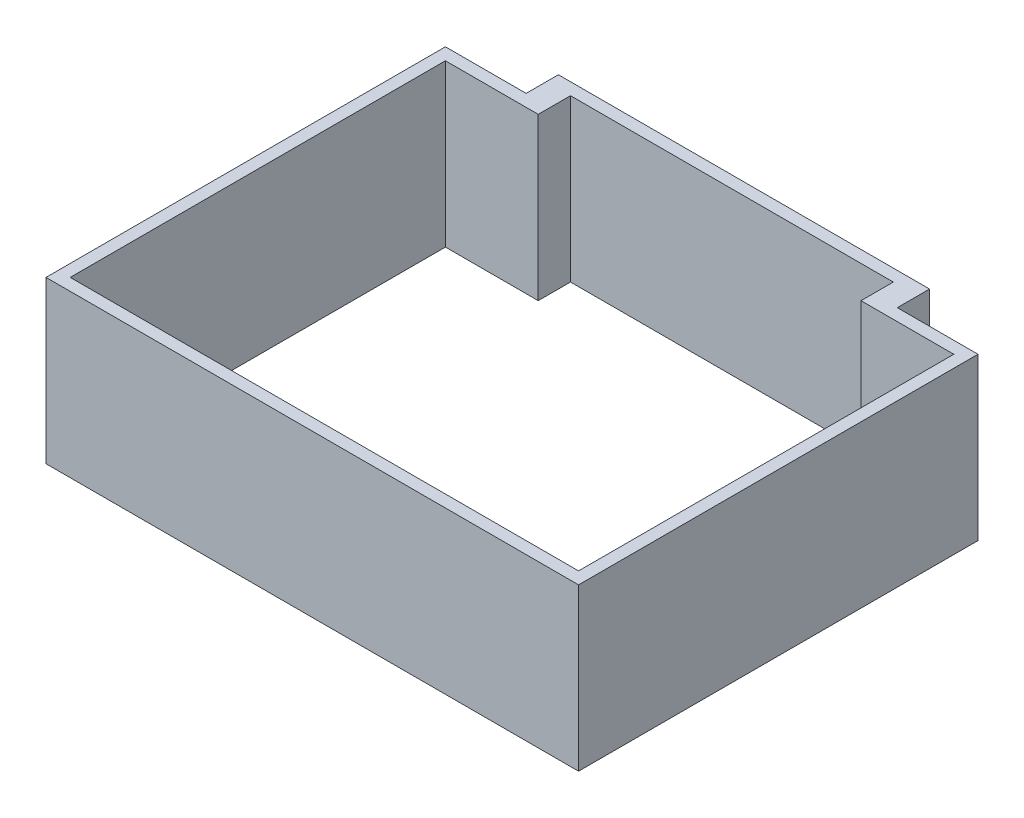
ISO-10303-21;
HEADER;
FILE_DESCRIPTION(('STEP AP214'),'2;1');
FILE_NAME('part.step','',(''),(''),'','','');
FILE_SCHEMA(('AUTOMOTIVE_DESIGN { 1 0 10303 214 1 1 1 1 }'));
ENDSEC;
DATA;
#1=APPLICATION_CONTEXT('core data for automotive mechanical design processes');
#2=APPLICATION_PROTOCOL_DEFINITION('international standard','automotive_design',2000,#1);
#3=PRODUCT_CONTEXT('',#1,'mechanical');
#4=PRODUCT('Part','Part','',(#3));
#5=PRODUCT_RELATED_PRODUCT_CATEGORY('part','',(#4));
#6=PRODUCT_DEFINITION_FORMATION('','',#4);
#7=PRODUCT_DEFINITION_CONTEXT('part definition',#1,'design');
#8=PRODUCT_DEFINITION('design','',#6,#7);
#9=PRODUCT_DEFINITION_SHAPE('','',#8);
#10=(LENGTH_UNIT() NAMED_UNIT(*) SI_UNIT(.MILLI.,.METRE.));
#11=(NAMED_UNIT(*) PLANE_ANGLE_UNIT() SI_UNIT($,.RADIAN.));
#12=(NAMED_UNIT(*) SI_UNIT($,.STERADIAN.) SOLID_ANGLE_UNIT());
#13=UNCERTAINTY_MEASURE_WITH_UNIT(LENGTH_MEASURE(1.E-05),#10,'distance_accuracy_value','');
#14=(GEOMETRIC_REPRESENTATION_CONTEXT(3) GLOBAL_UNCERTAINTY_ASSIGNED_CONTEXT((#13)) GLOBAL_UNIT_ASSIGNED_CONTEXT((#10,
#11,#12)) REPRESENTATION_CONTEXT('',''));
#15=CARTESIAN_POINT('',(0.,0.,0.));
#16=DIRECTION('',(0.,0.,1.));
#17=DIRECTION('',(1.,0.,0.));
#18=AXIS2_PLACEMENT_3D('',#15,#16,#17);
#19=CARTESIAN_POINT('',(0.,0.,5.5));
#20=DIRECTION('',(0.,0.,1.));
#21=DIRECTION('',(1.,0.,0.));
#22=AXIS2_PLACEMENT_3D('',#19,#20,#21);
#23=PLANE('',#22);
#24=DIRECTION('',(1.,0.,0.));
#25=VECTOR('',#24,1.);
#26=CARTESIAN_POINT('',(20.,-10.,5.5));
#27=LINE('',#26,#25);
#28=CARTESIAN_POINT('',(20.,-10.,5.5));
#29=VERTEX_POINT('',#28);
#30=CARTESIAN_POINT('',(31.5,-10.,5.5));
#31=VERTEX_POINT('',#30);
#32=EDGE_CURVE('E56',#29,#31,#27,.T.);
#33=ORIENTED_EDGE('',*,*,#32,.T.);
#34=DIRECTION('',(0.,1.,0.));
#35=VECTOR('',#34,1.);
#36=CARTESIAN_POINT('',(31.5,0.,5.5));
#37=LINE('',#36,#35);
#38=CARTESIAN_POINT('',(31.5,10.,5.5));
#39=VERTEX_POINT('',#38);
#40=EDGE_CURVE('E199',#31,#39,#37,.T.);
#41=ORIENTED_EDGE('',*,*,#40,.T.);
#42=DIRECTION('',(-1.,0.,0.));
#43=VECTOR('',#42,1.);
#44=CARTESIAN_POINT('',(23.,10.,5.5));
#45=LINE('',#44,#43);
#46=CARTESIAN_POINT('',(20.,10.,5.5));
#47=VERTEX_POINT('',#46);
#48=EDGE_CURVE('E215',#39,#47,#45,.T.);
#49=ORIENTED_EDGE('',*,*,#48,.T.);
#50=DIRECTION('',(0.,-1.,0.));
#51=VECTOR('',#50,1.);
#52=CARTESIAN_POINT('',(20.,10.,5.5));
#53=LINE('',#52,#51);
#54=EDGE_CURVE('E212',#47,#29,#53,.T.);
#55=ORIENTED_EDGE('',*,*,#54,.T.);
#56=EDGE_LOOP('',(#33,#41,#49,#55));
#57=FACE_BOUND('',#56,.T.);
#58=ADVANCED_FACE('F41',(#57),#23,.T.);
#59=CARTESIAN_POINT('',(23.,-10.,5.5));
#60=DIRECTION('',(-1.,0.,0.));
#61=DIRECTION('',(0.,0.,1.));
#62=AXIS2_PLACEMENT_3D('',#59,#60,#61);
#63=PLANE('',#62);
#64=DIRECTION('',(0.,1.,0.));
#65=VECTOR('',#64,1.);
#66=CARTESIAN_POINT('',(23.,-10.,4.));
#67=LINE('',#66,#65);
#68=CARTESIAN_POINT('',(23.,-10.,4.));
#69=VERTEX_POINT('',#68);
#70=CARTESIAN_POINT('',(23.,10.,4.));
#71=VERTEX_POINT('',#70);
#72=EDGE_CURVE('E11',#69,#71,#67,.T.);
#73=ORIENTED_EDGE('',*,*,#72,.F.);
#74=DIRECTION('',(0.,0.,-1.));
#75=VECTOR('',#74,1.);
#76=CARTESIAN_POINT('',(23.,-10.,5.5));
#77=LINE('',#76,#75);
#78=CARTESIAN_POINT('',(23.,-10.,0.));
#79=VERTEX_POINT('',#78);
#80=EDGE_CURVE('E224',#69,#79,#77,.T.);
#81=ORIENTED_EDGE('',*,*,#80,.T.);
#82=DIRECTION('',(0.,1.,0.));
#83=VECTOR('',#82,1.);
#84=CARTESIAN_POINT('',(23.,-10.,0.));
#85=LINE('',#84,#83);
#86=CARTESIAN_POINT('',(23.,10.,0.));
#87=VERTEX_POINT('',#86);
#88=EDGE_CURVE('E211',#79,#87,#85,.T.);
#89=ORIENTED_EDGE('',*,*,#88,.T.);
#90=DIRECTION('',(0.,0.,-1.));
#91=VECTOR('',#90,1.);
#92=CARTESIAN_POINT('',(23.,10.,5.5));
#93=LINE('',#92,#91);
#94=EDGE_CURVE('E222',#71,#87,#93,.T.);
#95=ORIENTED_EDGE('',*,*,#94,.F.);
#96=EDGE_LOOP('',(#73,#81,#89,#95));
#97=FACE_BOUND('',#96,.T.);
#98=ADVANCED_FACE('F294',(#97),#63,.F.);
#99=CARTESIAN_POINT('',(0.,0.,1.5));
#100=DIRECTION('',(0.,0.,1.));
#101=DIRECTION('',(1.,0.,0.));
#102=AXIS2_PLACEMENT_3D('',#99,#100,#101);
#103=PLANE('',#102);
#104=DIRECTION('',(1.,0.,0.));
#105=VECTOR('',#104,1.);
#106=CARTESIAN_POINT('',(-22.,-10.,1.5));
#107=LINE('',#106,#105);
#108=CARTESIAN_POINT('',(-20.,-10.,1.5));
#109=VERTEX_POINT('',#108);
#110=CARTESIAN_POINT('',(20.,-10.,1.5));
#111=VERTEX_POINT('',#110);
#112=EDGE_CURVE('E270',#109,#111,#107,.T.);
#113=ORIENTED_EDGE('',*,*,#112,.T.);
#114=DIRECTION('',(0.,1.,0.));
#115=VECTOR('',#114,1.);
#116=CARTESIAN_POINT('',(20.,0.,1.5));
#117=LINE('',#116,#115);
#118=CARTESIAN_POINT('',(20.,10.,1.5));
#119=VERTEX_POINT('',#118);
#120=EDGE_CURVE('E229',#111,#119,#117,.T.);
#121=ORIENTED_EDGE('',*,*,#120,.T.);
#122=DIRECTION('',(-1.,0.,0.));
#123=VECTOR('',#122,1.);
#124=CARTESIAN_POINT('',(22.,10.,1.5));
#125=LINE('',#124,#123);
#126=CARTESIAN_POINT('',(-20.,10.,1.5));
#127=VERTEX_POINT('',#126);
#128=EDGE_CURVE('E272',#119,#127,#125,.T.);
#129=ORIENTED_EDGE('',*,*,#128,.T.);
#130=DIRECTION('',(0.,-1.,0.));
#131=VECTOR('',#130,1.);
#132=CARTESIAN_POINT('',(-20.,0.,1.5));
#133=LINE('',#132,#131);
#134=EDGE_CURVE('E267',#127,#109,#133,.T.);
#135=ORIENTED_EDGE('',*,*,#134,.T.);
#136=EDGE_LOOP('',(#113,#121,#129,#135));
#137=FACE_BOUND('',#136,.T.);
#138=ADVANCED_FACE('F319',(#137),#103,.T.);
#139=CARTESIAN_POINT('',(0.,0.,5.5));
#140=DIRECTION('',(0.,0.,1.));
#141=DIRECTION('',(1.,0.,0.));
#142=AXIS2_PLACEMENT_3D('',#139,#140,#141);
#143=PLANE('',#142);
#144=DIRECTION('',(-1.,0.,0.));
#145=VECTOR('',#144,1.);
#146=CARTESIAN_POINT('',(-20.,10.,5.5));
#147=LINE('',#146,#145);
#148=CARTESIAN_POINT('',(-20.,10.,5.5));
#149=VERTEX_POINT('',#148);
#150=CARTESIAN_POINT('',(-31.5,10.,5.5));
#151=VERTEX_POINT('',#150);
#152=EDGE_CURVE('E252',#149,#151,#147,.T.);
#153=ORIENTED_EDGE('',*,*,#152,.T.);
#154=DIRECTION('',(0.,-1.,0.));
#155=VECTOR('',#154,1.);
#156=CARTESIAN_POINT('',(-31.5,0.,5.5));
#157=LINE('',#156,#155);
#158=CARTESIAN_POINT('',(-31.5,-10.,5.5));
#159=VERTEX_POINT('',#158);
#160=EDGE_CURVE('E240',#151,#159,#157,.T.);
#161=ORIENTED_EDGE('',*,*,#160,.T.);
#162=DIRECTION('',(1.,0.,0.));
#163=VECTOR('',#162,1.);
#164=CARTESIAN_POINT('',(-23.,-10.,5.5));
#165=LINE('',#164,#163);
#166=CARTESIAN_POINT('',(-20.,-10.,5.5));
#167=VERTEX_POINT('',#166);
#168=EDGE_CURVE('E248',#159,#167,#165,.T.);
#169=ORIENTED_EDGE('',*,*,#168,.T.);
#170=DIRECTION('',(0.,1.,0.));
#171=VECTOR('',#170,1.);
#172=CARTESIAN_POINT('',(-20.,-10.,5.5));
#173=LINE('',#172,#171);
#174=EDGE_CURVE('E250',#167,#149,#173,.T.);
#175=ORIENTED_EDGE('',*,*,#174,.T.);
#176=EDGE_LOOP('',(#153,#161,#169,#175));
#177=FACE_BOUND('',#176,.T.);
#178=ADVANCED_FACE('F334',(#177),#143,.T.);
#179=CARTESIAN_POINT('',(-23.,10.,5.5));
#180=DIRECTION('',(1.,0.,0.));
#181=DIRECTION('',(0.,0.,-1.));
#182=AXIS2_PLACEMENT_3D('',#179,#180,#181);
#183=PLANE('',#182);
#184=DIRECTION('',(0.,-1.,0.));
#185=VECTOR('',#184,1.);
#186=CARTESIAN_POINT('',(-23.,10.,4.));
#187=LINE('',#186,#185);
#188=CARTESIAN_POINT('',(-23.,10.,4.));
#189=VERTEX_POINT('',#188);
#190=CARTESIAN_POINT('',(-23.,-10.,4.));
#191=VERTEX_POINT('',#190);
#192=EDGE_CURVE('E49',#189,#191,#187,.T.);
#193=ORIENTED_EDGE('',*,*,#192,.F.);
#194=DIRECTION('',(0.,0.,-1.));
#195=VECTOR('',#194,1.);
#196=CARTESIAN_POINT('',(-23.,10.,5.5));
#197=LINE('',#196,#195);
#198=CARTESIAN_POINT('',(-23.,10.,0.));
#199=VERTEX_POINT('',#198);
#200=EDGE_CURVE('E254',#189,#199,#197,.T.);
#201=ORIENTED_EDGE('',*,*,#200,.T.);
#202=DIRECTION('',(0.,-1.,0.));
#203=VECTOR('',#202,1.);
#204=CARTESIAN_POINT('',(-23.,10.,0.));
#205=LINE('',#204,#203);
#206=CARTESIAN_POINT('',(-23.,-10.,0.));
#207=VERTEX_POINT('',#206);
#208=EDGE_CURVE('E164',#199,#207,#205,.T.);
#209=ORIENTED_EDGE('',*,*,#208,.T.);
#210=DIRECTION('',(0.,0.,-1.));
#211=VECTOR('',#210,1.);
#212=CARTESIAN_POINT('',(-23.,-10.,5.5));
#213=LINE('',#212,#211);
#214=EDGE_CURVE('E265',#191,#207,#213,.T.);
#215=ORIENTED_EDGE('',*,*,#214,.F.);
#216=EDGE_LOOP('',(#193,#201,#209,#215));
#217=FACE_BOUND('',#216,.T.);
#218=ADVANCED_FACE('F284',(#217),#183,.F.);
#219=CARTESIAN_POINT('',(-22.,-10.,1.5));
#220=DIRECTION('',(0.,1.,0.));
#221=DIRECTION('',(0.,0.,1.));
#222=AXIS2_PLACEMENT_3D('',#219,#220,#221);
#223=PLANE('',#222);
#224=DIRECTION('',(0.,0.,-1.));
#225=VECTOR('',#224,1.);
#226=CARTESIAN_POINT('',(-31.5,-10.,52.));
#227=LINE('',#226,#225);
#228=CARTESIAN_POINT('',(-31.5,-10.,52.));
#229=VERTEX_POINT('',#228);
#230=EDGE_CURVE('E237',#229,#159,#227,.T.);
#231=ORIENTED_EDGE('',*,*,#230,.F.);
#232=DIRECTION('',(1.,0.,0.));
#233=VECTOR('',#232,1.);
#234=CARTESIAN_POINT('',(-33.,-10.,52.));
#235=LINE('',#234,#233);
#236=CARTESIAN_POINT('',(31.5,-10.,52.));
#237=VERTEX_POINT('',#236);
#238=EDGE_CURVE('E183',#229,#237,#235,.T.);
#239=ORIENTED_EDGE('',*,*,#238,.T.);
#240=DIRECTION('',(0.,0.,-1.));
#241=VECTOR('',#240,1.);
#242=CARTESIAN_POINT('',(31.5,-10.,52.));
#243=LINE('',#242,#241);
#244=EDGE_CURVE('E196',#237,#31,#243,.T.);
#245=ORIENTED_EDGE('',*,*,#244,.T.);
#246=ORIENTED_EDGE('',*,*,#32,.F.);
#247=DIRECTION('',(0.,0.,-1.));
#248=VECTOR('',#247,1.);
#249=CARTESIAN_POINT('',(20.,-10.,5.5));
#250=LINE('',#249,#248);
#251=EDGE_CURVE('E226',#29,#111,#250,.T.);
#252=ORIENTED_EDGE('',*,*,#251,.T.);
#253=ORIENTED_EDGE('',*,*,#112,.F.);
#254=DIRECTION('',(0.,0.,-1.));
#255=VECTOR('',#254,1.);
#256=CARTESIAN_POINT('',(-20.,-10.,5.5));
#257=LINE('',#256,#255);
#258=EDGE_CURVE('E262',#167,#109,#257,.T.);
#259=ORIENTED_EDGE('',*,*,#258,.F.);
#260=ORIENTED_EDGE('',*,*,#168,.F.);
#261=EDGE_LOOP('',(#231,#239,#245,#246,#252,#253,#259,#260));
#262=FACE_BOUND('',#261,.T.);
#263=DIRECTION('',(0.,0.,-1.));
#264=VECTOR('',#263,1.);
#265=CARTESIAN_POINT('',(33.,-10.,5.5));
#266=LINE('',#265,#264);
#267=CARTESIAN_POINT('',(33.,-10.,53.5));
#268=VERTEX_POINT('',#267);
#269=CARTESIAN_POINT('',(33.,-10.,4.));
#270=VERTEX_POINT('',#269);
#271=EDGE_CURVE('E170',#268,#270,#266,.T.);
#272=ORIENTED_EDGE('',*,*,#271,.F.);
#273=DIRECTION('',(1.,0.,0.));
#274=VECTOR('',#273,1.);
#275=CARTESIAN_POINT('',(-33.,-10.,53.5));
#276=LINE('',#275,#274);
#277=CARTESIAN_POINT('',(-33.,-10.,53.5));
#278=VERTEX_POINT('',#277);
#279=EDGE_CURVE('E168',#278,#268,#276,.T.);
#280=ORIENTED_EDGE('',*,*,#279,.F.);
#281=DIRECTION('',(0.,0.,-1.));
#282=VECTOR('',#281,1.);
#283=CARTESIAN_POINT('',(-33.,-10.,5.5));
#284=LINE('',#283,#282);
#285=CARTESIAN_POINT('',(-33.,-10.,4.));
#286=VERTEX_POINT('',#285);
#287=EDGE_CURVE('E155',#278,#286,#284,.T.);
#288=ORIENTED_EDGE('',*,*,#287,.T.);
#289=DIRECTION('',(1.,0.,0.));
#290=VECTOR('',#289,1.);
#291=CARTESIAN_POINT('',(-33.,-10.,4.));
#292=LINE('',#291,#290);
#293=EDGE_CURVE('E243',#286,#191,#292,.T.);
#294=ORIENTED_EDGE('',*,*,#293,.T.);
#295=ORIENTED_EDGE('',*,*,#214,.T.);
#296=DIRECTION('',(1.,0.,0.));
#297=VECTOR('',#296,1.);
#298=CARTESIAN_POINT('',(-22.,-10.,0.));
#299=LINE('',#298,#297);
#300=EDGE_CURVE('E269',#207,#79,#299,.T.);
#301=ORIENTED_EDGE('',*,*,#300,.T.);
#302=ORIENTED_EDGE('',*,*,#80,.F.);
#303=DIRECTION('',(1.,0.,0.));
#304=VECTOR('',#303,1.);
#305=CARTESIAN_POINT('',(21.,-10.,4.));
#306=LINE('',#305,#304);
#307=EDGE_CURVE('E201',#69,#270,#306,.T.);
#308=ORIENTED_EDGE('',*,*,#307,.T.);
#309=EDGE_LOOP('',(#272,#280,#288,#294,#295,#301,#302,#308));
#310=FACE_BOUND('',#309,.T.);
#311=ADVANCED_FACE('F43',(#262,#310),#223,.F.);
#312=CARTESIAN_POINT('',(22.,10.,1.5));
#313=DIRECTION('',(0.,-1.,0.));
#314=DIRECTION('',(0.,0.,-1.));
#315=AXIS2_PLACEMENT_3D('',#312,#313,#314);
#316=PLANE('',#315);
#317=DIRECTION('',(0.,0.,-1.));
#318=VECTOR('',#317,1.);
#319=CARTESIAN_POINT('',(-33.,10.,5.5));
#320=LINE('',#319,#318);
#321=CARTESIAN_POINT('',(-33.,10.,53.5));
#322=VERTEX_POINT('',#321);
#323=CARTESIAN_POINT('',(-33.,10.,4.));
#324=VERTEX_POINT('',#323);
#325=EDGE_CURVE('E165',#322,#324,#320,.T.);
#326=ORIENTED_EDGE('',*,*,#325,.F.);
#327=DIRECTION('',(-1.,0.,0.));
#328=VECTOR('',#327,1.);
#329=CARTESIAN_POINT('',(33.,10.,53.5));
#330=LINE('',#329,#328);
#331=CARTESIAN_POINT('',(33.,10.,53.5));
#332=VERTEX_POINT('',#331);
#333=EDGE_CURVE('E179',#332,#322,#330,.T.);
#334=ORIENTED_EDGE('',*,*,#333,.F.);
#335=DIRECTION('',(0.,0.,-1.));
#336=VECTOR('',#335,1.);
#337=CARTESIAN_POINT('',(33.,10.,5.5));
#338=LINE('',#337,#336);
#339=CARTESIAN_POINT('',(33.,10.,4.));
#340=VERTEX_POINT('',#339);
#341=EDGE_CURVE('E207',#332,#340,#338,.T.);
#342=ORIENTED_EDGE('',*,*,#341,.T.);
#343=DIRECTION('',(-1.,0.,0.));
#344=VECTOR('',#343,1.);
#345=CARTESIAN_POINT('',(33.,10.,4.));
#346=LINE('',#345,#344);
#347=EDGE_CURVE('E205',#340,#71,#346,.T.);
#348=ORIENTED_EDGE('',*,*,#347,.T.);
#349=ORIENTED_EDGE('',*,*,#94,.T.);
#350=DIRECTION('',(-1.,0.,0.));
#351=VECTOR('',#350,1.);
#352=CARTESIAN_POINT('',(22.,10.,0.));
#353=LINE('',#352,#351);
#354=EDGE_CURVE('E273',#87,#199,#353,.T.);
#355=ORIENTED_EDGE('',*,*,#354,.T.);
#356=ORIENTED_EDGE('',*,*,#200,.F.);
#357=DIRECTION('',(-1.,0.,0.));
#358=VECTOR('',#357,1.);
#359=CARTESIAN_POINT('',(-21.,10.,4.));
#360=LINE('',#359,#358);
#361=EDGE_CURVE('E245',#189,#324,#360,.T.);
#362=ORIENTED_EDGE('',*,*,#361,.T.);
#363=EDGE_LOOP('',(#326,#334,#342,#348,#349,#355,#356,#362));
#364=FACE_BOUND('',#363,.T.);
#365=DIRECTION('',(-1.,0.,0.));
#366=VECTOR('',#365,1.);
#367=CARTESIAN_POINT('',(33.,10.,52.));
#368=LINE('',#367,#366);
#369=CARTESIAN_POINT('',(31.5,10.,52.));
#370=VERTEX_POINT('',#369);
#371=CARTESIAN_POINT('',(-31.5,10.,52.));
#372=VERTEX_POINT('',#371);
#373=EDGE_CURVE('E180',#370,#372,#368,.T.);
#374=ORIENTED_EDGE('',*,*,#373,.T.);
#375=DIRECTION('',(0.,0.,-1.));
#376=VECTOR('',#375,1.);
#377=CARTESIAN_POINT('',(-31.5,10.,52.));
#378=LINE('',#377,#376);
#379=EDGE_CURVE('E234',#372,#151,#378,.T.);
#380=ORIENTED_EDGE('',*,*,#379,.T.);
#381=ORIENTED_EDGE('',*,*,#152,.F.);
#382=DIRECTION('',(0.,0.,-1.));
#383=VECTOR('',#382,1.);
#384=CARTESIAN_POINT('',(-20.,10.,5.5));
#385=LINE('',#384,#383);
#386=EDGE_CURVE('E259',#149,#127,#385,.T.);
#387=ORIENTED_EDGE('',*,*,#386,.T.);
#388=ORIENTED_EDGE('',*,*,#128,.F.);
#389=DIRECTION('',(0.,0.,-1.));
#390=VECTOR('',#389,1.);
#391=CARTESIAN_POINT('',(20.,10.,5.5));
#392=LINE('',#391,#390);
#393=EDGE_CURVE('E217',#47,#119,#392,.T.);
#394=ORIENTED_EDGE('',*,*,#393,.F.);
#395=ORIENTED_EDGE('',*,*,#48,.F.);
#396=DIRECTION('',(0.,0.,-1.));
#397=VECTOR('',#396,1.);
#398=CARTESIAN_POINT('',(31.5,10.,52.));
#399=LINE('',#398,#397);
#400=EDGE_CURVE('E193',#370,#39,#399,.T.);
#401=ORIENTED_EDGE('',*,*,#400,.F.);
#402=EDGE_LOOP('',(#374,#380,#381,#387,#388,#394,#395,#401));
#403=FACE_BOUND('',#402,.T.);
#404=ADVANCED_FACE('F287',(#364,#403),#316,.F.);
#405=CARTESIAN_POINT('',(0.,0.,0.));
#406=DIRECTION('',(0.,0.,1.));
#407=DIRECTION('',(1.,0.,0.));
#408=AXIS2_PLACEMENT_3D('',#405,#406,#407);
#409=PLANE('',#408);
#410=ORIENTED_EDGE('',*,*,#88,.F.);
#411=ORIENTED_EDGE('',*,*,#300,.F.);
#412=ORIENTED_EDGE('',*,*,#208,.F.);
#413=ORIENTED_EDGE('',*,*,#354,.F.);
#414=EDGE_LOOP('',(#410,#411,#412,#413));
#415=FACE_BOUND('',#414,.T.);
#416=ADVANCED_FACE('F292',(#415),#409,.F.);
#417=CARTESIAN_POINT('',(-20.,-10.,5.5));
#418=DIRECTION('',(-1.,0.,0.));
#419=DIRECTION('',(0.,0.,1.));
#420=AXIS2_PLACEMENT_3D('',#417,#418,#419);
#421=PLANE('',#420);
#422=ORIENTED_EDGE('',*,*,#134,.F.);
#423=ORIENTED_EDGE('',*,*,#386,.F.);
#424=ORIENTED_EDGE('',*,*,#174,.F.);
#425=ORIENTED_EDGE('',*,*,#258,.T.);
#426=EDGE_LOOP('',(#422,#423,#424,#425));
#427=FACE_BOUND('',#426,.T.);
#428=ADVANCED_FACE('F331',(#427),#421,.F.);
#429=CARTESIAN_POINT('',(0.,0.,4.));
#430=DIRECTION('',(0.,0.,1.));
#431=DIRECTION('',(1.,0.,0.));
#432=AXIS2_PLACEMENT_3D('',#429,#430,#431);
#433=PLANE('',#432);
#434=DIRECTION('',(0.,-1.,0.));
#435=VECTOR('',#434,1.);
#436=CARTESIAN_POINT('',(-33.,10.,4.));
#437=LINE('',#436,#435);
#438=EDGE_CURVE('E162',#324,#286,#437,.T.);
#439=ORIENTED_EDGE('',*,*,#438,.F.);
#440=ORIENTED_EDGE('',*,*,#361,.F.);
#441=ORIENTED_EDGE('',*,*,#192,.T.);
#442=ORIENTED_EDGE('',*,*,#293,.F.);
#443=EDGE_LOOP('',(#439,#440,#441,#442));
#444=FACE_BOUND('',#443,.T.);
#445=ADVANCED_FACE('F280',(#444),#433,.F.);
#446=CARTESIAN_POINT('',(-33.,10.,5.5));
#447=DIRECTION('',(1.,0.,0.));
#448=DIRECTION('',(0.,0.,-1.));
#449=AXIS2_PLACEMENT_3D('',#446,#447,#448);
#450=PLANE('',#449);
#451=ORIENTED_EDGE('',*,*,#438,.T.);
#452=ORIENTED_EDGE('',*,*,#287,.F.);
#453=DIRECTION('',(0.,-1.,0.));
#454=VECTOR('',#453,1.);
#455=CARTESIAN_POINT('',(-33.,10.,53.5));
#456=LINE('',#455,#454);
#457=EDGE_CURVE('E160',#322,#278,#456,.T.);
#458=ORIENTED_EDGE('',*,*,#457,.F.);
#459=ORIENTED_EDGE('',*,*,#325,.T.);
#460=EDGE_LOOP('',(#451,#452,#458,#459));
#461=FACE_BOUND('',#460,.T.);
#462=ADVANCED_FACE('F157',(#461),#450,.F.);
#463=CARTESIAN_POINT('',(-31.5,-10.,52.));
#464=DIRECTION('',(-1.,0.,0.));
#465=DIRECTION('',(0.,0.,1.));
#466=AXIS2_PLACEMENT_3D('',#463,#464,#465);
#467=PLANE('',#466);
#468=ORIENTED_EDGE('',*,*,#160,.F.);
#469=ORIENTED_EDGE('',*,*,#379,.F.);
#470=DIRECTION('',(0.,1.,0.));
#471=VECTOR('',#470,1.);
#472=CARTESIAN_POINT('',(-31.5,-10.,52.));
#473=LINE('',#472,#471);
#474=EDGE_CURVE('E231',#229,#372,#473,.T.);
#475=ORIENTED_EDGE('',*,*,#474,.F.);
#476=ORIENTED_EDGE('',*,*,#230,.T.);
#477=EDGE_LOOP('',(#468,#469,#475,#476));
#478=FACE_BOUND('',#477,.T.);
#479=ADVANCED_FACE('F324',(#478),#467,.F.);
#480=CARTESIAN_POINT('',(20.,10.,5.5));
#481=DIRECTION('',(1.,0.,0.));
#482=DIRECTION('',(0.,0.,-1.));
#483=AXIS2_PLACEMENT_3D('',#480,#481,#482);
#484=PLANE('',#483);
#485=ORIENTED_EDGE('',*,*,#120,.F.);
#486=ORIENTED_EDGE('',*,*,#251,.F.);
#487=ORIENTED_EDGE('',*,*,#54,.F.);
#488=ORIENTED_EDGE('',*,*,#393,.T.);
#489=EDGE_LOOP('',(#485,#486,#487,#488));
#490=FACE_BOUND('',#489,.T.);
#491=ADVANCED_FACE('F312',(#490),#484,.F.);
#492=CARTESIAN_POINT('',(0.,0.,4.));
#493=DIRECTION('',(0.,0.,1.));
#494=DIRECTION('',(1.,0.,0.));
#495=AXIS2_PLACEMENT_3D('',#492,#493,#494);
#496=PLANE('',#495);
#497=DIRECTION('',(0.,1.,0.));
#498=VECTOR('',#497,1.);
#499=CARTESIAN_POINT('',(33.,-10.,4.));
#500=LINE('',#499,#498);
#501=EDGE_CURVE('E203',#270,#340,#500,.T.);
#502=ORIENTED_EDGE('',*,*,#501,.F.);
#503=ORIENTED_EDGE('',*,*,#307,.F.);
#504=ORIENTED_EDGE('',*,*,#72,.T.);
#505=ORIENTED_EDGE('',*,*,#347,.F.);
#506=EDGE_LOOP('',(#502,#503,#504,#505));
#507=FACE_BOUND('',#506,.T.);
#508=ADVANCED_FACE('F298',(#507),#496,.F.);
#509=CARTESIAN_POINT('',(33.,-10.,5.5));
#510=DIRECTION('',(-1.,0.,0.));
#511=DIRECTION('',(0.,0.,1.));
#512=AXIS2_PLACEMENT_3D('',#509,#510,#511);
#513=PLANE('',#512);
#514=ORIENTED_EDGE('',*,*,#501,.T.);
#515=ORIENTED_EDGE('',*,*,#341,.F.);
#516=DIRECTION('',(0.,1.,0.));
#517=VECTOR('',#516,1.);
#518=CARTESIAN_POINT('',(33.,-10.,53.5));
#519=LINE('',#518,#517);
#520=EDGE_CURVE('E174',#268,#332,#519,.T.);
#521=ORIENTED_EDGE('',*,*,#520,.F.);
#522=ORIENTED_EDGE('',*,*,#271,.T.);
#523=EDGE_LOOP('',(#514,#515,#521,#522));
#524=FACE_BOUND('',#523,.T.);
#525=ADVANCED_FACE('F301',(#524),#513,.F.);
#526=CARTESIAN_POINT('',(31.5,10.,52.));
#527=DIRECTION('',(1.,0.,0.));
#528=DIRECTION('',(0.,0.,-1.));
#529=AXIS2_PLACEMENT_3D('',#526,#527,#528);
#530=PLANE('',#529);
#531=ORIENTED_EDGE('',*,*,#40,.F.);
#532=ORIENTED_EDGE('',*,*,#244,.F.);
#533=DIRECTION('',(0.,-1.,0.));
#534=VECTOR('',#533,1.);
#535=CARTESIAN_POINT('',(31.5,10.,52.));
#536=LINE('',#535,#534);
#537=EDGE_CURVE('E188',#370,#237,#536,.T.);
#538=ORIENTED_EDGE('',*,*,#537,.F.);
#539=ORIENTED_EDGE('',*,*,#400,.T.);
#540=EDGE_LOOP('',(#531,#532,#538,#539));
#541=FACE_BOUND('',#540,.T.);
#542=ADVANCED_FACE('F303',(#541),#530,.F.);
#543=CARTESIAN_POINT('',(0.,0.,52.));
#544=DIRECTION('',(0.,0.,1.));
#545=DIRECTION('',(1.,0.,0.));
#546=AXIS2_PLACEMENT_3D('',#543,#544,#545);
#547=PLANE('',#546);
#548=ORIENTED_EDGE('',*,*,#238,.F.);
#549=ORIENTED_EDGE('',*,*,#474,.T.);
#550=ORIENTED_EDGE('',*,*,#373,.F.);
#551=ORIENTED_EDGE('',*,*,#537,.T.);
#552=EDGE_LOOP('',(#548,#549,#550,#551));
#553=FACE_BOUND('',#552,.T.);
#554=ADVANCED_FACE('F309',(#553),#547,.F.);
#555=CARTESIAN_POINT('',(0.,0.,53.5));
#556=DIRECTION('',(0.,0.,1.));
#557=DIRECTION('',(1.,0.,0.));
#558=AXIS2_PLACEMENT_3D('',#555,#556,#557);
#559=PLANE('',#558);
#560=ORIENTED_EDGE('',*,*,#457,.T.);
#561=ORIENTED_EDGE('',*,*,#279,.T.);
#562=ORIENTED_EDGE('',*,*,#520,.T.);
#563=ORIENTED_EDGE('',*,*,#333,.T.);
#564=EDGE_LOOP('',(#560,#561,#562,#563));
#565=FACE_BOUND('',#564,.T.);
#566=ADVANCED_FACE('F177',(#565),#559,.T.);
#567=CLOSED_SHELL('',(#58,#98,#138,#178,#218,#311,#404,#416,#428,#445,#462,#479,#491,#508,#525,
#542,#554,#566));
#568=MANIFOLD_SOLID_BREP('B2',#567);
#569=ADVANCED_BREP_SHAPE_REPRESENTATION('',(#18,#568),#14);
#570=SHAPE_DEFINITION_REPRESENTATION(#9,#569);
ENDSEC;
END-ISO-10303-21;
